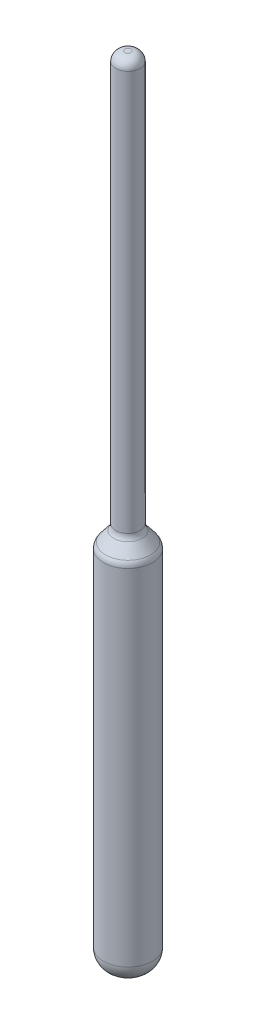
ISO-10303-21;
HEADER;
FILE_DESCRIPTION(('STEP AP214'),'2;1');
FILE_NAME('part.step','',(''),(''),'','','');
FILE_SCHEMA(('AUTOMOTIVE_DESIGN { 1 0 10303 214 1 1 1 1 }'));
ENDSEC;
DATA;
#1=APPLICATION_CONTEXT('core data for automotive mechanical design processes');
#2=APPLICATION_PROTOCOL_DEFINITION('international standard','automotive_design',2000,#1);
#3=PRODUCT_CONTEXT('',#1,'mechanical');
#4=PRODUCT('Part','Part','',(#3));
#5=PRODUCT_RELATED_PRODUCT_CATEGORY('part','',(#4));
#6=PRODUCT_DEFINITION_FORMATION('','',#4);
#7=PRODUCT_DEFINITION_CONTEXT('part definition',#1,'design');
#8=PRODUCT_DEFINITION('design','',#6,#7);
#9=PRODUCT_DEFINITION_SHAPE('','',#8);
#10=(LENGTH_UNIT() NAMED_UNIT(*) SI_UNIT(.MILLI.,.METRE.));
#11=(NAMED_UNIT(*) PLANE_ANGLE_UNIT() SI_UNIT($,.RADIAN.));
#12=(NAMED_UNIT(*) SI_UNIT($,.STERADIAN.) SOLID_ANGLE_UNIT());
#13=UNCERTAINTY_MEASURE_WITH_UNIT(LENGTH_MEASURE(1.E-05),#10,'distance_accuracy_value','');
#14=(GEOMETRIC_REPRESENTATION_CONTEXT(3) GLOBAL_UNCERTAINTY_ASSIGNED_CONTEXT((#13)) GLOBAL_UNIT_ASSIGNED_CONTEXT((#10,
#11,#12)) REPRESENTATION_CONTEXT('',''));
#15=CARTESIAN_POINT('',(0.,0.,0.));
#16=DIRECTION('',(0.,0.,1.));
#17=DIRECTION('',(1.,0.,0.));
#18=AXIS2_PLACEMENT_3D('',#15,#16,#17);
#19=CARTESIAN_POINT('',(-8.,0.,0.));
#20=DIRECTION('',(0.,1.,0.));
#21=DIRECTION('',(0.,0.,1.));
#22=AXIS2_PLACEMENT_3D('',#19,#20,#21);
#23=PLANE('',#22);
#24=CARTESIAN_POINT('',(0.,0.,0.));
#25=DIRECTION('',(0.,1.,0.));
#26=DIRECTION('',(0.,0.,1.));
#27=AXIS2_PLACEMENT_3D('',#24,#25,#26);
#28=CIRCLE('',#27,2.00000000000001);
#29=CARTESIAN_POINT('',(0.,0.,2.00000000000001));
#30=VERTEX_POINT('',#29);
#31=EDGE_CURVE('E44',#30,#30,#28,.F.);
#32=ORIENTED_EDGE('',*,*,#31,.T.);
#33=EDGE_LOOP('',(#32));
#34=FACE_BOUND('',#33,.T.);
#35=ADVANCED_FACE('F37',(#34),#23,.F.);
#36=CARTESIAN_POINT('',(0.,260.,0.));
#37=DIRECTION('',(0.,-1.,0.));
#38=DIRECTION('',(0.,0.,-1.));
#39=AXIS2_PLACEMENT_3D('',#36,#37,#38);
#40=PLANE('',#39);
#41=CARTESIAN_POINT('',(0.,260.,0.));
#42=DIRECTION('',(0.,-1.,0.));
#43=DIRECTION('',(0.,0.,-1.));
#44=AXIS2_PLACEMENT_3D('',#41,#42,#43);
#45=CIRCLE('',#44,0.999999999999992);
#46=CARTESIAN_POINT('',(0.,260.,-0.999999999999992));
#47=VERTEX_POINT('',#46);
#48=EDGE_CURVE('E63',#47,#47,#45,.F.);
#49=ORIENTED_EDGE('',*,*,#48,.T.);
#50=EDGE_LOOP('',(#49));
#51=FACE_BOUND('',#50,.T.);
#52=ADVANCED_FACE('F90',(#51),#40,.F.);
#53=CARTESIAN_POINT('',(0.,0.,0.));
#54=DIRECTION('',(0.,-1.,0.));
#55=DIRECTION('',(0.,0.,-1.));
#56=AXIS2_PLACEMENT_3D('',#53,#54,#55);
#57=CYLINDRICAL_SURFACE('',#56,3.99999999999999);
#58=CARTESIAN_POINT('',(0.,126.052343178075,0.));
#59=DIRECTION('',(0.,-1.,0.));
#60=DIRECTION('',(0.,0.,-1.));
#61=AXIS2_PLACEMENT_3D('',#58,#59,#60);
#62=CIRCLE('',#61,3.99999999999999);
#63=CARTESIAN_POINT('',(0.,126.052343178075,-3.99999999999999));
#64=VERTEX_POINT('',#63);
#65=EDGE_CURVE('E48',#64,#64,#62,.F.);
#66=ORIENTED_EDGE('',*,*,#65,.T.);
#67=EDGE_LOOP('',(#66));
#68=FACE_BOUND('',#67,.T.);
#69=CARTESIAN_POINT('',(0.,257.,0.));
#70=DIRECTION('',(0.,-1.,0.));
#71=DIRECTION('',(0.,0.,-1.));
#72=AXIS2_PLACEMENT_3D('',#69,#70,#71);
#73=CIRCLE('',#72,3.99999999999999);
#74=CARTESIAN_POINT('',(0.,257.,-3.99999999999999));
#75=VERTEX_POINT('',#74);
#76=EDGE_CURVE('E66',#75,#75,#73,.T.);
#77=ORIENTED_EDGE('',*,*,#76,.T.);
#78=EDGE_LOOP('',(#77));
#79=FACE_BOUND('',#78,.T.);
#80=ADVANCED_FACE('F70',(#68,#79),#57,.T.);
#81=CARTESIAN_POINT('',(0.,125.,0.));
#82=DIRECTION('',(0.,-1.,0.));
#83=DIRECTION('',(0.,0.,-1.));
#84=AXIS2_PLACEMENT_3D('',#81,#82,#83);
#85=CONICAL_SURFACE('',#84,3.99999999999998,0.674740942223556);
#86=CARTESIAN_POINT('',(0.,124.178258035411,0.));
#87=DIRECTION('',(0.,-1.,0.));
#88=DIRECTION('',(0.,0.,-1.));
#89=AXIS2_PLACEMENT_3D('',#86,#87,#88);
#90=CIRCLE('',#89,4.65739357167092);
#91=CARTESIAN_POINT('',(0.,124.178258035411,-4.65739357167092));
#92=VERTEX_POINT('',#91);
#93=EDGE_CURVE('E52',#92,#92,#90,.T.);
#94=ORIENTED_EDGE('',*,*,#93,.T.);
#95=EDGE_LOOP('',(#94));
#96=FACE_BOUND('',#95,.T.);
#97=CARTESIAN_POINT('',(0.,120.821741964589,0.));
#98=DIRECTION('',(0.,1.,0.));
#99=DIRECTION('',(0.,0.,1.));
#100=AXIS2_PLACEMENT_3D('',#97,#98,#99);
#101=CIRCLE('',#100,7.34260642832909);
#102=CARTESIAN_POINT('',(0.,120.821741964589,7.34260642832909));
#103=VERTEX_POINT('',#102);
#104=EDGE_CURVE('E57',#103,#103,#101,.T.);
#105=ORIENTED_EDGE('',*,*,#104,.T.);
#106=EDGE_LOOP('',(#105));
#107=FACE_BOUND('',#106,.T.);
#108=ADVANCED_FACE('F85',(#96,#107),#85,.T.);
#109=CARTESIAN_POINT('',(0.,0.,0.));
#110=DIRECTION('',(0.,-1.,0.));
#111=DIRECTION('',(0.,0.,-1.));
#112=AXIS2_PLACEMENT_3D('',#109,#110,#111);
#113=CYLINDRICAL_SURFACE('',#112,8.00000000000001);
#114=CARTESIAN_POINT('',(0.,6.,0.));
#115=DIRECTION('',(0.,1.,0.));
#116=DIRECTION('',(0.,0.,1.));
#117=AXIS2_PLACEMENT_3D('',#114,#115,#116);
#118=CIRCLE('',#117,8.00000000000001);
#119=CARTESIAN_POINT('',(0.,6.,8.00000000000001));
#120=VERTEX_POINT('',#119);
#121=EDGE_CURVE('E10',#120,#120,#118,.T.);
#122=ORIENTED_EDGE('',*,*,#121,.T.);
#123=EDGE_LOOP('',(#122));
#124=FACE_BOUND('',#123,.T.);
#125=CARTESIAN_POINT('',(0.,118.947656821925,0.));
#126=DIRECTION('',(0.,1.,0.));
#127=DIRECTION('',(0.,0.,1.));
#128=AXIS2_PLACEMENT_3D('',#125,#126,#127);
#129=CIRCLE('',#128,8.00000000000001);
#130=CARTESIAN_POINT('',(0.,118.947656821925,8.00000000000001));
#131=VERTEX_POINT('',#130);
#132=EDGE_CURVE('E60',#131,#131,#129,.F.);
#133=ORIENTED_EDGE('',*,*,#132,.T.);
#134=EDGE_LOOP('',(#133));
#135=FACE_BOUND('',#134,.T.);
#136=ADVANCED_FACE('F75',(#124,#135),#113,.T.);
#137=CARTESIAN_POINT('',(0.,257.,0.));
#138=DIRECTION('',(0.,-1.,0.));
#139=DIRECTION('',(0.,0.,-1.));
#140=AXIS2_PLACEMENT_3D('',#137,#138,#139);
#141=DEGENERATE_TOROIDAL_SURFACE('',#140,0.999999999999992,3.,.T.);
#142=ORIENTED_EDGE('',*,*,#48,.F.);
#143=EDGE_LOOP('',(#142));
#144=FACE_BOUND('',#143,.T.);
#145=ORIENTED_EDGE('',*,*,#76,.F.);
#146=EDGE_LOOP('',(#145));
#147=FACE_BOUND('',#146,.T.);
#148=ADVANCED_FACE('F72',(#144,#147),#141,.T.);
#149=CARTESIAN_POINT('',(0.,118.947656821925,0.));
#150=DIRECTION('',(0.,1.,0.));
#151=DIRECTION('',(0.,0.,1.));
#152=AXIS2_PLACEMENT_3D('',#149,#150,#151);
#153=TOROIDAL_SURFACE('',#152,5.00000000000001,3.);
#154=ORIENTED_EDGE('',*,*,#104,.F.);
#155=EDGE_LOOP('',(#154));
#156=FACE_BOUND('',#155,.T.);
#157=ORIENTED_EDGE('',*,*,#132,.F.);
#158=EDGE_LOOP('',(#157));
#159=FACE_BOUND('',#158,.T.);
#160=ADVANCED_FACE('F74',(#156,#159),#153,.T.);
#161=CARTESIAN_POINT('',(0.,126.052343178075,0.));
#162=DIRECTION('',(0.,-1.,0.));
#163=DIRECTION('',(0.,0.,-1.));
#164=AXIS2_PLACEMENT_3D('',#161,#162,#163);
#165=TOROIDAL_SURFACE('',#164,6.99999999999999,3.);
#166=ORIENTED_EDGE('',*,*,#65,.F.);
#167=EDGE_LOOP('',(#166));
#168=FACE_BOUND('',#167,.T.);
#169=ORIENTED_EDGE('',*,*,#93,.F.);
#170=EDGE_LOOP('',(#169));
#171=FACE_BOUND('',#170,.T.);
#172=ADVANCED_FACE('F82',(#168,#171),#165,.F.);
#173=CARTESIAN_POINT('',(0.,6.,0.));
#174=DIRECTION('',(0.,1.,0.));
#175=DIRECTION('',(0.,0.,1.));
#176=AXIS2_PLACEMENT_3D('',#173,#174,#175);
#177=DEGENERATE_TOROIDAL_SURFACE('',#176,2.00000000000001,6.,.T.);
#178=ORIENTED_EDGE('',*,*,#121,.F.);
#179=EDGE_LOOP('',(#178));
#180=FACE_BOUND('',#179,.T.);
#181=ORIENTED_EDGE('',*,*,#31,.F.);
#182=EDGE_LOOP('',(#181));
#183=FACE_BOUND('',#182,.T.);
#184=ADVANCED_FACE('F39',(#180,#183),#177,.T.);
#185=CLOSED_SHELL('',(#35,#52,#80,#108,#136,#148,#160,#172,#184));
#186=MANIFOLD_SOLID_BREP('B2',#185);
#187=ADVANCED_BREP_SHAPE_REPRESENTATION('',(#18,#186),#14);
#188=SHAPE_DEFINITION_REPRESENTATION(#9,#187);
ENDSEC;
END-ISO-10303-21;
